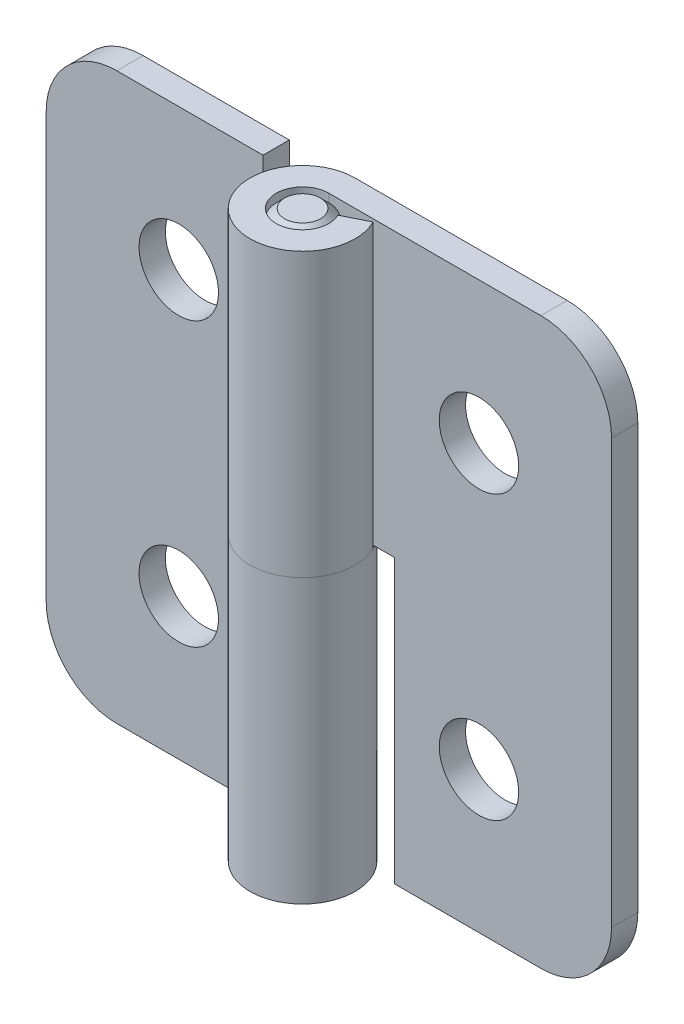
ISO-10303-21;
HEADER;
FILE_DESCRIPTION(('STEP AP214'),'2;1');
FILE_NAME('part.step','',(''),(''),'','','');
FILE_SCHEMA(('AUTOMOTIVE_DESIGN { 1 0 10303 214 1 1 1 1 }'));
ENDSEC;
DATA;
#1=APPLICATION_CONTEXT('core data for automotive mechanical design processes');
#2=APPLICATION_PROTOCOL_DEFINITION('international standard','automotive_design',2000,#1);
#3=PRODUCT_CONTEXT('',#1,'mechanical');
#4=PRODUCT('Part','Part','',(#3));
#5=PRODUCT_RELATED_PRODUCT_CATEGORY('part','',(#4));
#6=PRODUCT_DEFINITION_FORMATION('','',#4);
#7=PRODUCT_DEFINITION_CONTEXT('part definition',#1,'design');
#8=PRODUCT_DEFINITION('design','',#6,#7);
#9=PRODUCT_DEFINITION_SHAPE('','',#8);
#10=(LENGTH_UNIT() NAMED_UNIT(*) SI_UNIT(.MILLI.,.METRE.));
#11=(NAMED_UNIT(*) PLANE_ANGLE_UNIT() SI_UNIT($,.RADIAN.));
#12=(NAMED_UNIT(*) SI_UNIT($,.STERADIAN.) SOLID_ANGLE_UNIT());
#13=UNCERTAINTY_MEASURE_WITH_UNIT(LENGTH_MEASURE(1.E-05),#10,'distance_accuracy_value','');
#14=(GEOMETRIC_REPRESENTATION_CONTEXT(3) GLOBAL_UNCERTAINTY_ASSIGNED_CONTEXT((#13)) GLOBAL_UNIT_ASSIGNED_CONTEXT((#10,
#11,#12)) REPRESENTATION_CONTEXT('',''));
#15=CARTESIAN_POINT('',(0.,0.,0.));
#16=DIRECTION('',(0.,0.,1.));
#17=DIRECTION('',(1.,0.,0.));
#18=AXIS2_PLACEMENT_3D('',#15,#16,#17);
#19=CARTESIAN_POINT('',(1.61289999999782,25.3999999999621,4.7244));
#20=DIRECTION('',(0.,1.,0.));
#21=DIRECTION('',(0.,0.,1.));
#22=AXIS2_PLACEMENT_3D('',#19,#20,#21);
#23=PLANE('',#22);
#24=CARTESIAN_POINT('',(0.,25.3999999999716,4.7244));
#25=DIRECTION('',(0.,-1.,0.));
#26=DIRECTION('',(-1.,0.,0.));
#27=AXIS2_PLACEMENT_3D('',#24,#25,#26);
#28=CIRCLE('',#27,1.61289999994096);
#29=CARTESIAN_POINT('',(-1.61289999994096,25.3999999999716,4.7244));
#30=VERTEX_POINT('',#29);
#31=EDGE_CURVE('P0_E17',#30,#30,#28,.T.);
#32=ORIENTED_EDGE('',*,*,#31,.F.);
#33=EDGE_LOOP('',(#32));
#34=FACE_BOUND('',#33,.T.);
#35=ADVANCED_FACE('P0_F14',(#34),#23,.T.);
#36=CARTESIAN_POINT('',(0.,-25.4,4.7244));
#37=DIRECTION('',(0.,-1.,0.));
#38=DIRECTION('',(0.,0.,-1.));
#39=AXIS2_PLACEMENT_3D('',#36,#37,#38);
#40=PLANE('',#39);
#41=CARTESIAN_POINT('',(0.,-25.4000000000095,4.7244));
#42=DIRECTION('',(0.,1.,0.));
#43=DIRECTION('',(0.,0.,1.));
#44=AXIS2_PLACEMENT_3D('',#41,#42,#43);
#45=CIRCLE('',#44,1.61290000005465);
#46=CARTESIAN_POINT('',(0.,-25.4000000000095,6.33730000005465));
#47=VERTEX_POINT('',#46);
#48=EDGE_CURVE('P0_E26',#47,#47,#45,.T.);
#49=ORIENTED_EDGE('',*,*,#48,.F.);
#50=EDGE_LOOP('',(#49));
#51=FACE_BOUND('',#50,.T.);
#52=ADVANCED_FACE('P0_F37',(#51),#40,.T.);
#53=CARTESIAN_POINT('',(0.,24.6380000000196,4.7244));
#54=DIRECTION('',(0.,-1.,0.));
#55=DIRECTION('',(-1.,0.,0.));
#56=AXIS2_PLACEMENT_3D('',#53,#54,#55);
#57=CONICAL_SURFACE('',#56,2.37489999994978,0.785398163434747);
#58=CARTESIAN_POINT('',(0.,24.6379999999953,4.7244));
#59=DIRECTION('',(0.,-1.,0.));
#60=DIRECTION('',(0.,0.,-1.));
#61=AXIS2_PLACEMENT_3D('',#58,#59,#60);
#62=CIRCLE('',#61,2.37489999996468);
#63=CARTESIAN_POINT('',(0.,24.6379999999953,2.34950000003532));
#64=VERTEX_POINT('',#63);
#65=EDGE_CURVE('P0_E21',#64,#64,#62,.T.);
#66=ORIENTED_EDGE('',*,*,#65,.F.);
#67=EDGE_LOOP('',(#66));
#68=FACE_BOUND('',#67,.T.);
#69=ORIENTED_EDGE('',*,*,#31,.T.);
#70=EDGE_LOOP('',(#69));
#71=FACE_BOUND('',#70,.T.);
#72=ADVANCED_FACE('P0_F34',(#68,#71),#57,.T.);
#73=CARTESIAN_POINT('',(0.,-24.6380000000575,4.7244));
#74=DIRECTION('',(0.,1.,0.));
#75=DIRECTION('',(0.,0.,1.));
#76=AXIS2_PLACEMENT_3D('',#73,#74,#75);
#77=CONICAL_SURFACE('',#76,2.37490000000662,0.785398163397448);
#78=CARTESIAN_POINT('',(0.,-24.6380000000047,4.7244));
#79=DIRECTION('',(0.,-1.,0.));
#80=DIRECTION('',(0.,0.,-1.));
#81=AXIS2_PLACEMENT_3D('',#78,#79,#80);
#82=CIRCLE('',#81,2.37489999996468);
#83=CARTESIAN_POINT('',(0.,-24.6380000000047,2.34950000003532));
#84=VERTEX_POINT('',#83);
#85=EDGE_CURVE('P0_E10',#84,#84,#82,.F.);
#86=ORIENTED_EDGE('',*,*,#85,.F.);
#87=EDGE_LOOP('',(#86));
#88=FACE_BOUND('',#87,.T.);
#89=ORIENTED_EDGE('',*,*,#48,.T.);
#90=EDGE_LOOP('',(#89));
#91=FACE_BOUND('',#90,.T.);
#92=ADVANCED_FACE('P0_F45',(#88,#91),#77,.T.);
#93=CARTESIAN_POINT('',(0.,25.3999999999621,4.7244));
#94=DIRECTION('',(0.,-1.,0.));
#95=DIRECTION('',(0.,0.,-1.));
#96=AXIS2_PLACEMENT_3D('',#93,#94,#95);
#97=CYLINDRICAL_SURFACE('',#96,2.37489999996468);
#98=ORIENTED_EDGE('',*,*,#85,.T.);
#99=EDGE_LOOP('',(#98));
#100=FACE_BOUND('',#99,.T.);
#101=ORIENTED_EDGE('',*,*,#65,.T.);
#102=EDGE_LOOP('',(#101));
#103=FACE_BOUND('',#102,.T.);
#104=ADVANCED_FACE('P0_F43',(#100,#103),#97,.T.);
#105=CLOSED_SHELL('',(#35,#52,#72,#92,#104));
#106=MANIFOLD_SOLID_BREP('P0_B1',#105);
#107=CARTESIAN_POINT('',(-25.4,-25.4,2.3622));
#108=DIRECTION('',(0.,0.,1.));
#109=DIRECTION('',(-1.,0.,0.));
#110=AXIS2_PLACEMENT_3D('',#107,#108,#109);
#111=PLANE('',#110);
#112=DIRECTION('',(1.,0.,0.));
#113=VECTOR('',#112,1.);
#114=CARTESIAN_POINT('',(-25.4,25.4,2.3622));
#115=LINE('',#114,#113);
#116=CARTESIAN_POINT('',(-5.9182,25.4,2.3622));
#117=VERTEX_POINT('',#116);
#118=CARTESIAN_POINT('',(-19.05,25.4,2.3622));
#119=VERTEX_POINT('',#118);
#120=EDGE_CURVE('P1_E116',#117,#119,#115,.F.);
#121=ORIENTED_EDGE('',*,*,#120,.T.);
#122=CARTESIAN_POINT('',(-19.05,19.05,2.3622));
#123=DIRECTION('',(0.,0.,-1.));
#124=DIRECTION('',(1.,0.,0.));
#125=AXIS2_PLACEMENT_3D('',#122,#123,#124);
#126=CIRCLE('',#125,6.35);
#127=CARTESIAN_POINT('',(-25.4,19.05,2.3622));
#128=VERTEX_POINT('',#127);
#129=EDGE_CURVE('P1_E118',#128,#119,#126,.T.);
#130=ORIENTED_EDGE('',*,*,#129,.F.);
#131=DIRECTION('',(0.,-1.,0.));
#132=VECTOR('',#131,1.);
#133=CARTESIAN_POINT('',(-25.4,-25.4,2.3622));
#134=LINE('',#133,#132);
#135=CARTESIAN_POINT('',(-25.4,-19.05,2.3622));
#136=VERTEX_POINT('',#135);
#137=EDGE_CURVE('P1_E121',#136,#128,#134,.F.);
#138=ORIENTED_EDGE('',*,*,#137,.F.);
#139=CARTESIAN_POINT('',(-19.05,-19.05,2.3622));
#140=DIRECTION('',(0.,0.,-1.));
#141=DIRECTION('',(1.,0.,0.));
#142=AXIS2_PLACEMENT_3D('',#139,#140,#141);
#143=CIRCLE('',#142,6.35);
#144=CARTESIAN_POINT('',(-19.05,-25.4,2.3622));
#145=VERTEX_POINT('',#144);
#146=EDGE_CURVE('P1_E148',#145,#136,#143,.T.);
#147=ORIENTED_EDGE('',*,*,#146,.F.);
#148=DIRECTION('',(1.,0.,0.));
#149=VECTOR('',#148,1.);
#150=CARTESIAN_POINT('',(0.,-25.4,2.3622));
#151=LINE('',#150,#149);
#152=CARTESIAN_POINT('',(0.,-25.4,2.3622));
#153=VERTEX_POINT('',#152);
#154=EDGE_CURVE('P1_E101',#145,#153,#151,.T.);
#155=ORIENTED_EDGE('',*,*,#154,.T.);
#156=DIRECTION('',(0.,1.,0.));
#157=VECTOR('',#156,1.);
#158=CARTESIAN_POINT('',(0.,-25.4,2.3622));
#159=LINE('',#158,#157);
#160=CARTESIAN_POINT('',(0.,0.,2.3622));
#161=VERTEX_POINT('',#160);
#162=EDGE_CURVE('P1_E82',#153,#161,#159,.T.);
#163=ORIENTED_EDGE('',*,*,#162,.T.);
#164=DIRECTION('',(1.,0.,0.));
#165=VECTOR('',#164,1.);
#166=CARTESIAN_POINT('',(0.,0.,2.3622));
#167=LINE('',#166,#165);
#168=CARTESIAN_POINT('',(-5.9182,0.,2.3622));
#169=VERTEX_POINT('',#168);
#170=EDGE_CURVE('P1_E145',#169,#161,#167,.T.);
#171=ORIENTED_EDGE('',*,*,#170,.F.);
#172=DIRECTION('',(0.,-1.,0.));
#173=VECTOR('',#172,1.);
#174=CARTESIAN_POINT('',(-5.9182,25.4,2.3622));
#175=LINE('',#174,#173);
#176=EDGE_CURVE('P1_E109',#169,#117,#175,.F.);
#177=ORIENTED_EDGE('',*,*,#176,.T.);
#178=EDGE_LOOP('',(#121,#130,#138,#147,#155,#163,#171,#177));
#179=FACE_BOUND('',#178,.T.);
#180=CARTESIAN_POINT('',(-13.4874,-12.7,2.3622));
#181=DIRECTION('',(0.,0.,-1.));
#182=DIRECTION('',(1.,0.,0.));
#183=AXIS2_PLACEMENT_3D('',#180,#181,#182);
#184=CIRCLE('',#183,3.56869999999999);
#185=CARTESIAN_POINT('',(-9.91870000000002,-12.7,2.3622));
#186=VERTEX_POINT('',#185);
#187=EDGE_CURVE('P1_E87',#186,#186,#184,.T.);
#188=ORIENTED_EDGE('',*,*,#187,.T.);
#189=EDGE_LOOP('',(#188));
#190=FACE_BOUND('',#189,.T.);
#191=CARTESIAN_POINT('',(-13.4874,12.7,2.3622));
#192=DIRECTION('',(0.,0.,-1.));
#193=DIRECTION('',(1.,0.,0.));
#194=AXIS2_PLACEMENT_3D('',#191,#192,#193);
#195=CIRCLE('',#194,3.56869999999999);
#196=CARTESIAN_POINT('',(-9.91870000000002,12.7,2.3622));
#197=VERTEX_POINT('',#196);
#198=EDGE_CURVE('P1_E19',#197,#197,#195,.T.);
#199=ORIENTED_EDGE('',*,*,#198,.T.);
#200=EDGE_LOOP('',(#199));
#201=FACE_BOUND('',#200,.T.);
#202=ADVANCED_FACE('P1_F16',(#179,#190,#201),#111,.T.);
#203=CARTESIAN_POINT('',(0.,-25.4,4.7244));
#204=DIRECTION('',(0.,1.,0.));
#205=DIRECTION('',(0.,0.,1.));
#206=AXIS2_PLACEMENT_3D('',#203,#204,#205);
#207=CYLINDRICAL_SURFACE('',#206,2.3622);
#208=CARTESIAN_POINT('',(0.,-25.4,4.7244));
#209=DIRECTION('',(0.,1.,0.));
#210=DIRECTION('',(0.,0.,1.));
#211=AXIS2_PLACEMENT_3D('',#208,#209,#210);
#212=CIRCLE('',#211,2.3622);
#213=CARTESIAN_POINT('',(-2.11396831338599,-25.4,3.6703));
#214=VERTEX_POINT('',#213);
#215=EDGE_CURVE('P1_E76',#153,#214,#212,.F.);
#216=ORIENTED_EDGE('',*,*,#215,.T.);
#217=DIRECTION('',(0.,-1.,0.));
#218=VECTOR('',#217,1.);
#219=CARTESIAN_POINT('',(-2.11396831338599,-25.4,3.6703));
#220=LINE('',#219,#218);
#221=CARTESIAN_POINT('',(-2.11396831338599,0.,3.6703));
#222=VERTEX_POINT('',#221);
#223=EDGE_CURVE('P1_E79',#222,#214,#220,.T.);
#224=ORIENTED_EDGE('',*,*,#223,.F.);
#225=CARTESIAN_POINT('',(0.,0.,4.7244));
#226=DIRECTION('',(0.,1.,0.));
#227=DIRECTION('',(0.,0.,1.));
#228=AXIS2_PLACEMENT_3D('',#225,#226,#227);
#229=CIRCLE('',#228,2.3622);
#230=EDGE_CURVE('P1_E142',#161,#222,#229,.F.);
#231=ORIENTED_EDGE('',*,*,#230,.F.);
#232=ORIENTED_EDGE('',*,*,#162,.F.);
#233=EDGE_LOOP('',(#216,#224,#231,#232));
#234=FACE_BOUND('',#233,.T.);
#235=ADVANCED_FACE('P1_F78',(#234),#207,.F.);
#236=CARTESIAN_POINT('',(-2.11396831338599,-25.4,3.6703));
#237=DIRECTION('',(0.446236559139785,0.,-0.89491504249682));
#238=DIRECTION('',(0.89491504249682,0.,0.446236559139785));
#239=AXIS2_PLACEMENT_3D('',#236,#237,#238);
#240=PLANE('',#239);
#241=DIRECTION('',(-0.89491504249682,0.,-0.446236559139785));
#242=VECTOR('',#241,1.);
#243=CARTESIAN_POINT('',(-2.11396831338599,-25.4,3.6703));
#244=LINE('',#243,#242);
#245=CARTESIAN_POINT('',(-4.22793662677198,-25.4,2.6162));
#246=VERTEX_POINT('',#245);
#247=EDGE_CURVE('P1_E86',#214,#246,#244,.T.);
#248=ORIENTED_EDGE('',*,*,#247,.T.);
#249=DIRECTION('',(0.,1.,0.));
#250=VECTOR('',#249,1.);
#251=CARTESIAN_POINT('',(-4.22793662677198,-25.4,2.6162));
#252=LINE('',#251,#250);
#253=CARTESIAN_POINT('',(-4.22793662677198,0.,2.6162));
#254=VERTEX_POINT('',#253);
#255=EDGE_CURVE('P1_E95',#254,#246,#252,.F.);
#256=ORIENTED_EDGE('',*,*,#255,.F.);
#257=DIRECTION('',(-0.89491504249682,0.,-0.446236559139785));
#258=VECTOR('',#257,1.);
#259=CARTESIAN_POINT('',(-2.11396831338599,0.,3.6703));
#260=LINE('',#259,#258);
#261=EDGE_CURVE('P1_E94',#222,#254,#260,.T.);
#262=ORIENTED_EDGE('',*,*,#261,.F.);
#263=ORIENTED_EDGE('',*,*,#223,.T.);
#264=EDGE_LOOP('',(#248,#256,#262,#263));
#265=FACE_BOUND('',#264,.T.);
#266=ADVANCED_FACE('P1_F91',(#265),#240,.T.);
#267=CARTESIAN_POINT('',(-13.4874,12.7,0.));
#268=DIRECTION('',(0.,0.,-1.));
#269=DIRECTION('',(1.,0.,0.));
#270=AXIS2_PLACEMENT_3D('',#267,#268,#269);
#271=CYLINDRICAL_SURFACE('',#270,3.56869999999999);
#272=CARTESIAN_POINT('',(-13.4874,12.7,0.));
#273=DIRECTION('',(0.,0.,-1.));
#274=DIRECTION('',(1.,0.,0.));
#275=AXIS2_PLACEMENT_3D('',#272,#273,#274);
#276=CIRCLE('',#275,3.56869999999999);
#277=CARTESIAN_POINT('',(-9.91870000000002,12.7,0.));
#278=VERTEX_POINT('',#277);
#279=EDGE_CURVE('P1_E137',#278,#278,#276,.F.);
#280=ORIENTED_EDGE('',*,*,#279,.F.);
#281=EDGE_LOOP('',(#280));
#282=FACE_BOUND('',#281,.T.);
#283=ORIENTED_EDGE('',*,*,#198,.F.);
#284=EDGE_LOOP('',(#283));
#285=FACE_BOUND('',#284,.T.);
#286=ADVANCED_FACE('P1_F156',(#282,#285),#271,.F.);
#287=CARTESIAN_POINT('',(-13.4874,-12.7,0.));
#288=DIRECTION('',(0.,0.,-1.));
#289=DIRECTION('',(1.,0.,0.));
#290=AXIS2_PLACEMENT_3D('',#287,#288,#289);
#291=CYLINDRICAL_SURFACE('',#290,3.56869999999999);
#292=CARTESIAN_POINT('',(-13.4874,-12.7,0.));
#293=DIRECTION('',(0.,0.,-1.));
#294=DIRECTION('',(1.,0.,0.));
#295=AXIS2_PLACEMENT_3D('',#292,#293,#294);
#296=CIRCLE('',#295,3.56869999999999);
#297=CARTESIAN_POINT('',(-9.91870000000002,-12.7,0.));
#298=VERTEX_POINT('',#297);
#299=EDGE_CURVE('P1_E134',#298,#298,#296,.F.);
#300=ORIENTED_EDGE('',*,*,#299,.F.);
#301=EDGE_LOOP('',(#300));
#302=FACE_BOUND('',#301,.T.);
#303=ORIENTED_EDGE('',*,*,#187,.F.);
#304=EDGE_LOOP('',(#303));
#305=FACE_BOUND('',#304,.T.);
#306=ADVANCED_FACE('P1_F158',(#302,#305),#291,.F.);
#307=CARTESIAN_POINT('',(0.,-25.4,4.7244));
#308=DIRECTION('',(0.,1.,0.));
#309=DIRECTION('',(0.,0.,1.));
#310=AXIS2_PLACEMENT_3D('',#307,#308,#309);
#311=PLANE('',#310);
#312=DIRECTION('',(0.,0.,-1.));
#313=VECTOR('',#312,1.);
#314=CARTESIAN_POINT('',(-19.05,-25.4,0.));
#315=LINE('',#314,#313);
#316=CARTESIAN_POINT('',(-19.05,-25.4,0.));
#317=VERTEX_POINT('',#316);
#318=EDGE_CURVE('P1_E103',#317,#145,#315,.F.);
#319=ORIENTED_EDGE('',*,*,#318,.F.);
#320=DIRECTION('',(1.,0.,0.));
#321=VECTOR('',#320,1.);
#322=CARTESIAN_POINT('',(0.,-25.4,0.));
#323=LINE('',#322,#321);
#324=CARTESIAN_POINT('',(0.,-25.4,0.));
#325=VERTEX_POINT('',#324);
#326=EDGE_CURVE('P1_E133',#325,#317,#323,.F.);
#327=ORIENTED_EDGE('',*,*,#326,.F.);
#328=CARTESIAN_POINT('',(0.,-25.4,4.7244));
#329=DIRECTION('',(0.,1.,0.));
#330=DIRECTION('',(0.,0.,1.));
#331=AXIS2_PLACEMENT_3D('',#328,#329,#330);
#332=CIRCLE('',#331,4.7244);
#333=EDGE_CURVE('P1_E100',#246,#325,#332,.T.);
#334=ORIENTED_EDGE('',*,*,#333,.F.);
#335=ORIENTED_EDGE('',*,*,#247,.F.);
#336=ORIENTED_EDGE('',*,*,#215,.F.);
#337=ORIENTED_EDGE('',*,*,#154,.F.);
#338=EDGE_LOOP('',(#319,#327,#334,#335,#336,#337));
#339=FACE_BOUND('',#338,.T.);
#340=ADVANCED_FACE('P1_F98',(#339),#311,.F.);
#341=CARTESIAN_POINT('',(-19.05,-19.05,0.));
#342=DIRECTION('',(0.,0.,-1.));
#343=DIRECTION('',(1.,0.,0.));
#344=AXIS2_PLACEMENT_3D('',#341,#342,#343);
#345=CYLINDRICAL_SURFACE('',#344,6.35);
#346=ORIENTED_EDGE('',*,*,#146,.T.);
#347=DIRECTION('',(0.,0.,-1.));
#348=VECTOR('',#347,1.);
#349=CARTESIAN_POINT('',(-25.4,-19.05,0.));
#350=LINE('',#349,#348);
#351=CARTESIAN_POINT('',(-25.4,-19.05,0.));
#352=VERTEX_POINT('',#351);
#353=EDGE_CURVE('P1_E124',#352,#136,#350,.F.);
#354=ORIENTED_EDGE('',*,*,#353,.F.);
#355=CARTESIAN_POINT('',(-19.05,-19.05,0.));
#356=DIRECTION('',(0.,0.,-1.));
#357=DIRECTION('',(1.,0.,0.));
#358=AXIS2_PLACEMENT_3D('',#355,#356,#357);
#359=CIRCLE('',#358,6.35);
#360=EDGE_CURVE('P1_E130',#317,#352,#359,.T.);
#361=ORIENTED_EDGE('',*,*,#360,.F.);
#362=ORIENTED_EDGE('',*,*,#318,.T.);
#363=EDGE_LOOP('',(#346,#354,#361,#362));
#364=FACE_BOUND('',#363,.T.);
#365=ADVANCED_FACE('P1_F201',(#364),#345,.T.);
#366=CARTESIAN_POINT('',(-25.4,-25.4,0.));
#367=DIRECTION('',(-1.,0.,0.));
#368=DIRECTION('',(0.,0.,-1.));
#369=AXIS2_PLACEMENT_3D('',#366,#367,#368);
#370=PLANE('',#369);
#371=ORIENTED_EDGE('',*,*,#137,.T.);
#372=DIRECTION('',(0.,0.,-1.));
#373=VECTOR('',#372,1.);
#374=CARTESIAN_POINT('',(-25.4,19.05,0.));
#375=LINE('',#374,#373);
#376=CARTESIAN_POINT('',(-25.4,19.05,0.));
#377=VERTEX_POINT('',#376);
#378=EDGE_CURVE('P1_E123',#377,#128,#375,.F.);
#379=ORIENTED_EDGE('',*,*,#378,.F.);
#380=DIRECTION('',(0.,-1.,0.));
#381=VECTOR('',#380,1.);
#382=CARTESIAN_POINT('',(-25.4,-25.4,0.));
#383=LINE('',#382,#381);
#384=EDGE_CURVE('P1_E129',#352,#377,#383,.F.);
#385=ORIENTED_EDGE('',*,*,#384,.F.);
#386=ORIENTED_EDGE('',*,*,#353,.T.);
#387=EDGE_LOOP('',(#371,#379,#385,#386));
#388=FACE_BOUND('',#387,.T.);
#389=ADVANCED_FACE('P1_F197',(#388),#370,.T.);
#390=CARTESIAN_POINT('',(-19.05,19.05,0.));
#391=DIRECTION('',(0.,0.,-1.));
#392=DIRECTION('',(1.,0.,0.));
#393=AXIS2_PLACEMENT_3D('',#390,#391,#392);
#394=CYLINDRICAL_SURFACE('',#393,6.35);
#395=ORIENTED_EDGE('',*,*,#129,.T.);
#396=DIRECTION('',(0.,0.,-1.));
#397=VECTOR('',#396,1.);
#398=CARTESIAN_POINT('',(-19.05,25.4,0.));
#399=LINE('',#398,#397);
#400=CARTESIAN_POINT('',(-19.05,25.4,0.));
#401=VERTEX_POINT('',#400);
#402=EDGE_CURVE('P1_E113',#119,#401,#399,.T.);
#403=ORIENTED_EDGE('',*,*,#402,.T.);
#404=CARTESIAN_POINT('',(-19.05,19.05,0.));
#405=DIRECTION('',(0.,0.,-1.));
#406=DIRECTION('',(1.,0.,0.));
#407=AXIS2_PLACEMENT_3D('',#404,#405,#406);
#408=CIRCLE('',#407,6.35);
#409=EDGE_CURVE('P1_E125',#377,#401,#408,.T.);
#410=ORIENTED_EDGE('',*,*,#409,.F.);
#411=ORIENTED_EDGE('',*,*,#378,.T.);
#412=EDGE_LOOP('',(#395,#403,#410,#411));
#413=FACE_BOUND('',#412,.T.);
#414=ADVANCED_FACE('P1_F193',(#413),#394,.T.);
#415=CARTESIAN_POINT('',(-25.4,25.4,0.));
#416=DIRECTION('',(0.,-1.,0.));
#417=DIRECTION('',(0.,0.,-1.));
#418=AXIS2_PLACEMENT_3D('',#415,#416,#417);
#419=PLANE('',#418);
#420=ORIENTED_EDGE('',*,*,#402,.F.);
#421=ORIENTED_EDGE('',*,*,#120,.F.);
#422=DIRECTION('',(0.,0.,-1.));
#423=VECTOR('',#422,1.);
#424=CARTESIAN_POINT('',(-5.9182,25.4,0.));
#425=LINE('',#424,#423);
#426=CARTESIAN_POINT('',(-5.9182,25.4,0.));
#427=VERTEX_POINT('',#426);
#428=EDGE_CURVE('P1_E112',#117,#427,#425,.T.);
#429=ORIENTED_EDGE('',*,*,#428,.T.);
#430=DIRECTION('',(1.,0.,0.));
#431=VECTOR('',#430,1.);
#432=CARTESIAN_POINT('',(0.,25.4,0.));
#433=LINE('',#432,#431);
#434=EDGE_CURVE('P1_E128',#401,#427,#433,.T.);
#435=ORIENTED_EDGE('',*,*,#434,.F.);
#436=EDGE_LOOP('',(#420,#421,#429,#435));
#437=FACE_BOUND('',#436,.T.);
#438=ADVANCED_FACE('P1_F189',(#437),#419,.F.);
#439=CARTESIAN_POINT('',(-5.9182,25.4,0.));
#440=DIRECTION('',(-1.,0.,0.));
#441=DIRECTION('',(0.,0.,-1.));
#442=AXIS2_PLACEMENT_3D('',#439,#440,#441);
#443=PLANE('',#442);
#444=DIRECTION('',(0.,-1.,0.));
#445=VECTOR('',#444,1.);
#446=CARTESIAN_POINT('',(-5.9182,-25.4,0.));
#447=LINE('',#446,#445);
#448=CARTESIAN_POINT('',(-5.9182,0.,0.));
#449=VERTEX_POINT('',#448);
#450=EDGE_CURVE('P1_E431',#427,#449,#447,.T.);
#451=ORIENTED_EDGE('',*,*,#450,.F.);
#452=ORIENTED_EDGE('',*,*,#428,.F.);
#453=ORIENTED_EDGE('',*,*,#176,.F.);
#454=DIRECTION('',(0.,0.,1.));
#455=VECTOR('',#454,1.);
#456=CARTESIAN_POINT('',(-5.9182,0.,4.7244));
#457=LINE('',#456,#455);
#458=EDGE_CURVE('P1_E429',#449,#169,#457,.T.);
#459=ORIENTED_EDGE('',*,*,#458,.F.);
#460=EDGE_LOOP('',(#451,#452,#453,#459));
#461=FACE_BOUND('',#460,.T.);
#462=ADVANCED_FACE('P1_F186',(#461),#443,.F.);
#463=CARTESIAN_POINT('',(0.,0.,4.7244));
#464=DIRECTION('',(0.,1.,0.));
#465=DIRECTION('',(0.,0.,1.));
#466=AXIS2_PLACEMENT_3D('',#463,#464,#465);
#467=PLANE('',#466);
#468=CARTESIAN_POINT('',(0.,0.,4.7244));
#469=DIRECTION('',(0.,1.,0.));
#470=DIRECTION('',(0.,0.,1.));
#471=AXIS2_PLACEMENT_3D('',#468,#469,#470);
#472=CIRCLE('',#471,4.7244);
#473=CARTESIAN_POINT('',(0.,0.,0.));
#474=VERTEX_POINT('',#473);
#475=EDGE_CURVE('P1_E34',#474,#254,#472,.F.);
#476=ORIENTED_EDGE('',*,*,#475,.F.);
#477=DIRECTION('',(1.,0.,0.));
#478=VECTOR('',#477,1.);
#479=CARTESIAN_POINT('',(0.,0.,0.));
#480=LINE('',#479,#478);
#481=EDGE_CURVE('P1_E25',#449,#474,#480,.T.);
#482=ORIENTED_EDGE('',*,*,#481,.F.);
#483=ORIENTED_EDGE('',*,*,#458,.T.);
#484=ORIENTED_EDGE('',*,*,#170,.T.);
#485=ORIENTED_EDGE('',*,*,#230,.T.);
#486=ORIENTED_EDGE('',*,*,#261,.T.);
#487=EDGE_LOOP('',(#476,#482,#483,#484,#485,#486));
#488=FACE_BOUND('',#487,.T.);
#489=ADVANCED_FACE('P1_F178',(#488),#467,.T.);
#490=CARTESIAN_POINT('',(0.,-25.4,4.7244));
#491=DIRECTION('',(0.,1.,0.));
#492=DIRECTION('',(0.,0.,1.));
#493=AXIS2_PLACEMENT_3D('',#490,#491,#492);
#494=CYLINDRICAL_SURFACE('',#493,4.7244);
#495=DIRECTION('',(0.,-1.,0.));
#496=VECTOR('',#495,1.);
#497=CARTESIAN_POINT('',(0.,-25.4,0.));
#498=LINE('',#497,#496);
#499=EDGE_CURVE('P1_E11',#474,#325,#498,.T.);
#500=ORIENTED_EDGE('',*,*,#499,.F.);
#501=ORIENTED_EDGE('',*,*,#475,.T.);
#502=ORIENTED_EDGE('',*,*,#255,.T.);
#503=ORIENTED_EDGE('',*,*,#333,.T.);
#504=EDGE_LOOP('',(#500,#501,#502,#503));
#505=FACE_BOUND('',#504,.T.);
#506=ADVANCED_FACE('P1_F172',(#505),#494,.T.);
#507=CARTESIAN_POINT('',(0.,-25.4,0.));
#508=DIRECTION('',(0.,0.,-1.));
#509=DIRECTION('',(1.,0.,0.));
#510=AXIS2_PLACEMENT_3D('',#507,#508,#509);
#511=PLANE('',#510);
#512=ORIENTED_EDGE('',*,*,#481,.T.);
#513=ORIENTED_EDGE('',*,*,#499,.T.);
#514=ORIENTED_EDGE('',*,*,#326,.T.);
#515=ORIENTED_EDGE('',*,*,#360,.T.);
#516=ORIENTED_EDGE('',*,*,#384,.T.);
#517=ORIENTED_EDGE('',*,*,#409,.T.);
#518=ORIENTED_EDGE('',*,*,#434,.T.);
#519=ORIENTED_EDGE('',*,*,#450,.T.);
#520=EDGE_LOOP('',(#512,#513,#514,#515,#516,#517,#518,#519));
#521=FACE_BOUND('',#520,.T.);
#522=ORIENTED_EDGE('',*,*,#299,.T.);
#523=EDGE_LOOP('',(#522));
#524=FACE_BOUND('',#523,.T.);
#525=ORIENTED_EDGE('',*,*,#279,.T.);
#526=EDGE_LOOP('',(#525));
#527=FACE_BOUND('',#526,.T.);
#528=ADVANCED_FACE('P1_F170',(#521,#524,#527),#511,.T.);
#529=CLOSED_SHELL('',(#202,#235,#266,#286,#306,#340,#365,#389,#414,#438,#462,#489,#506,#528));
#530=MANIFOLD_SOLID_BREP('P1_B1',#529);
#531=CARTESIAN_POINT('',(25.4,25.4,2.3622));
#532=DIRECTION('',(0.,0.,1.));
#533=DIRECTION('',(1.,0.,0.));
#534=AXIS2_PLACEMENT_3D('',#531,#532,#533);
#535=PLANE('',#534);
#536=DIRECTION('',(-1.,0.,0.));
#537=VECTOR('',#536,1.);
#538=CARTESIAN_POINT('',(25.4,-25.4,2.3622));
#539=LINE('',#538,#537);
#540=CARTESIAN_POINT('',(5.9182,-25.4,2.3622));
#541=VERTEX_POINT('',#540);
#542=CARTESIAN_POINT('',(19.05,-25.4,2.3622));
#543=VERTEX_POINT('',#542);
#544=EDGE_CURVE('P2_E116',#541,#543,#539,.F.);
#545=ORIENTED_EDGE('',*,*,#544,.T.);
#546=CARTESIAN_POINT('',(19.05,-19.05,2.3622));
#547=DIRECTION('',(0.,0.,-1.));
#548=DIRECTION('',(-1.,0.,0.));
#549=AXIS2_PLACEMENT_3D('',#546,#547,#548);
#550=CIRCLE('',#549,6.35);
#551=CARTESIAN_POINT('',(25.4,-19.05,2.3622));
#552=VERTEX_POINT('',#551);
#553=EDGE_CURVE('P2_E118',#552,#543,#550,.T.);
#554=ORIENTED_EDGE('',*,*,#553,.F.);
#555=DIRECTION('',(0.,1.,0.));
#556=VECTOR('',#555,1.);
#557=CARTESIAN_POINT('',(25.4,25.4,2.3622));
#558=LINE('',#557,#556);
#559=CARTESIAN_POINT('',(25.4,19.05,2.3622));
#560=VERTEX_POINT('',#559);
#561=EDGE_CURVE('P2_E121',#560,#552,#558,.F.);
#562=ORIENTED_EDGE('',*,*,#561,.F.);
#563=CARTESIAN_POINT('',(19.05,19.05,2.3622));
#564=DIRECTION('',(0.,0.,-1.));
#565=DIRECTION('',(-1.,0.,0.));
#566=AXIS2_PLACEMENT_3D('',#563,#564,#565);
#567=CIRCLE('',#566,6.35);
#568=CARTESIAN_POINT('',(19.05,25.4,2.3622));
#569=VERTEX_POINT('',#568);
#570=EDGE_CURVE('P2_E148',#569,#560,#567,.T.);
#571=ORIENTED_EDGE('',*,*,#570,.F.);
#572=DIRECTION('',(-1.,0.,0.));
#573=VECTOR('',#572,1.);
#574=CARTESIAN_POINT('',(0.,25.4,2.3622));
#575=LINE('',#574,#573);
#576=CARTESIAN_POINT('',(0.,25.4,2.36219999999999));
#577=VERTEX_POINT('',#576);
#578=EDGE_CURVE('P2_E101',#569,#577,#575,.T.);
#579=ORIENTED_EDGE('',*,*,#578,.T.);
#580=DIRECTION('',(0.,-1.,0.));
#581=VECTOR('',#580,1.);
#582=CARTESIAN_POINT('',(0.,25.4,2.36219999999999));
#583=LINE('',#582,#581);
#584=CARTESIAN_POINT('',(0.,0.,2.3622));
#585=VERTEX_POINT('',#584);
#586=EDGE_CURVE('P2_E82',#577,#585,#583,.T.);
#587=ORIENTED_EDGE('',*,*,#586,.T.);
#588=DIRECTION('',(-1.,0.,0.));
#589=VECTOR('',#588,1.);
#590=CARTESIAN_POINT('',(0.,0.,2.3622));
#591=LINE('',#590,#589);
#592=CARTESIAN_POINT('',(5.9182,0.,2.3622));
#593=VERTEX_POINT('',#592);
#594=EDGE_CURVE('P2_E145',#593,#585,#591,.T.);
#595=ORIENTED_EDGE('',*,*,#594,.F.);
#596=DIRECTION('',(0.,1.,0.));
#597=VECTOR('',#596,1.);
#598=CARTESIAN_POINT('',(5.9182,-25.4,2.3622));
#599=LINE('',#598,#597);
#600=EDGE_CURVE('P2_E109',#593,#541,#599,.F.);
#601=ORIENTED_EDGE('',*,*,#600,.T.);
#602=EDGE_LOOP('',(#545,#554,#562,#571,#579,#587,#595,#601));
#603=FACE_BOUND('',#602,.T.);
#604=CARTESIAN_POINT('',(13.4874,12.7,2.3622));
#605=DIRECTION('',(0.,0.,-1.));
#606=DIRECTION('',(-1.,0.,0.));
#607=AXIS2_PLACEMENT_3D('',#604,#605,#606);
#608=CIRCLE('',#607,3.56869999999999);
#609=CARTESIAN_POINT('',(9.91870000000002,12.7,2.3622));
#610=VERTEX_POINT('',#609);
#611=EDGE_CURVE('P2_E87',#610,#610,#608,.T.);
#612=ORIENTED_EDGE('',*,*,#611,.T.);
#613=EDGE_LOOP('',(#612));
#614=FACE_BOUND('',#613,.T.);
#615=CARTESIAN_POINT('',(13.4874,-12.7,2.3622));
#616=DIRECTION('',(0.,0.,-1.));
#617=DIRECTION('',(-1.,0.,0.));
#618=AXIS2_PLACEMENT_3D('',#615,#616,#617);
#619=CIRCLE('',#618,3.56869999999999);
#620=CARTESIAN_POINT('',(9.91870000000002,-12.7,2.3622));
#621=VERTEX_POINT('',#620);
#622=EDGE_CURVE('P2_E19',#621,#621,#619,.T.);
#623=ORIENTED_EDGE('',*,*,#622,.T.);
#624=EDGE_LOOP('',(#623));
#625=FACE_BOUND('',#624,.T.);
#626=ADVANCED_FACE('P2_F16',(#603,#614,#625),#535,.T.);
#627=CARTESIAN_POINT('',(0.,25.4,4.7244));
#628=DIRECTION('',(0.,-1.,0.));
#629=DIRECTION('',(0.,0.,1.));
#630=AXIS2_PLACEMENT_3D('',#627,#628,#629);
#631=CYLINDRICAL_SURFACE('',#630,2.3622);
#632=CARTESIAN_POINT('',(0.,25.4,4.7244));
#633=DIRECTION('',(0.,-1.,0.));
#634=DIRECTION('',(0.,0.,1.));
#635=AXIS2_PLACEMENT_3D('',#632,#633,#634);
#636=CIRCLE('',#635,2.3622);
#637=CARTESIAN_POINT('',(2.11396831338599,25.4,3.6703));
#638=VERTEX_POINT('',#637);
#639=EDGE_CURVE('P2_E76',#577,#638,#636,.F.);
#640=ORIENTED_EDGE('',*,*,#639,.T.);
#641=DIRECTION('',(0.,1.,0.));
#642=VECTOR('',#641,1.);
#643=CARTESIAN_POINT('',(2.11396831338599,25.4,3.6703));
#644=LINE('',#643,#642);
#645=CARTESIAN_POINT('',(2.11396831338599,0.,3.6703));
#646=VERTEX_POINT('',#645);
#647=EDGE_CURVE('P2_E79',#646,#638,#644,.T.);
#648=ORIENTED_EDGE('',*,*,#647,.F.);
#649=CARTESIAN_POINT('',(0.,0.,4.7244));
#650=DIRECTION('',(0.,-1.,0.));
#651=DIRECTION('',(0.,0.,1.));
#652=AXIS2_PLACEMENT_3D('',#649,#650,#651);
#653=CIRCLE('',#652,2.3622);
#654=EDGE_CURVE('P2_E142',#585,#646,#653,.F.);
#655=ORIENTED_EDGE('',*,*,#654,.F.);
#656=ORIENTED_EDGE('',*,*,#586,.F.);
#657=EDGE_LOOP('',(#640,#648,#655,#656));
#658=FACE_BOUND('',#657,.T.);
#659=ADVANCED_FACE('P2_F78',(#658),#631,.F.);
#660=CARTESIAN_POINT('',(2.11396831338599,25.4,3.6703));
#661=DIRECTION('',(-0.446236559139785,0.,-0.89491504249682));
#662=DIRECTION('',(-0.89491504249682,0.,0.446236559139785));
#663=AXIS2_PLACEMENT_3D('',#660,#661,#662);
#664=PLANE('',#663);
#665=DIRECTION('',(0.89491504249682,0.,-0.446236559139785));
#666=VECTOR('',#665,1.);
#667=CARTESIAN_POINT('',(2.11396831338599,25.4,3.6703));
#668=LINE('',#667,#666);
#669=CARTESIAN_POINT('',(4.22793662677198,25.4,2.6162));
#670=VERTEX_POINT('',#669);
#671=EDGE_CURVE('P2_E86',#638,#670,#668,.T.);
#672=ORIENTED_EDGE('',*,*,#671,.T.);
#673=DIRECTION('',(0.,-1.,0.));
#674=VECTOR('',#673,1.);
#675=CARTESIAN_POINT('',(4.22793662677198,25.4,2.6162));
#676=LINE('',#675,#674);
#677=CARTESIAN_POINT('',(4.22793662677198,0.,2.6162));
#678=VERTEX_POINT('',#677);
#679=EDGE_CURVE('P2_E95',#678,#670,#676,.F.);
#680=ORIENTED_EDGE('',*,*,#679,.F.);
#681=DIRECTION('',(0.89491504249682,0.,-0.446236559139785));
#682=VECTOR('',#681,1.);
#683=CARTESIAN_POINT('',(2.11396831338599,0.,3.6703));
#684=LINE('',#683,#682);
#685=EDGE_CURVE('P2_E94',#646,#678,#684,.T.);
#686=ORIENTED_EDGE('',*,*,#685,.F.);
#687=ORIENTED_EDGE('',*,*,#647,.T.);
#688=EDGE_LOOP('',(#672,#680,#686,#687));
#689=FACE_BOUND('',#688,.T.);
#690=ADVANCED_FACE('P2_F91',(#689),#664,.T.);
#691=CARTESIAN_POINT('',(13.4874,-12.7,0.));
#692=DIRECTION('',(0.,0.,-1.));
#693=DIRECTION('',(-1.,0.,0.));
#694=AXIS2_PLACEMENT_3D('',#691,#692,#693);
#695=CYLINDRICAL_SURFACE('',#694,3.56869999999999);
#696=CARTESIAN_POINT('',(13.4874,-12.7,0.));
#697=DIRECTION('',(0.,0.,-1.));
#698=DIRECTION('',(-1.,0.,0.));
#699=AXIS2_PLACEMENT_3D('',#696,#697,#698);
#700=CIRCLE('',#699,3.56869999999999);
#701=CARTESIAN_POINT('',(9.91870000000002,-12.7,0.));
#702=VERTEX_POINT('',#701);
#703=EDGE_CURVE('P2_E137',#702,#702,#700,.F.);
#704=ORIENTED_EDGE('',*,*,#703,.F.);
#705=EDGE_LOOP('',(#704));
#706=FACE_BOUND('',#705,.T.);
#707=ORIENTED_EDGE('',*,*,#622,.F.);
#708=EDGE_LOOP('',(#707));
#709=FACE_BOUND('',#708,.T.);
#710=ADVANCED_FACE('P2_F156',(#706,#709),#695,.F.);
#711=CARTESIAN_POINT('',(13.4874,12.7,0.));
#712=DIRECTION('',(0.,0.,-1.));
#713=DIRECTION('',(-1.,0.,0.));
#714=AXIS2_PLACEMENT_3D('',#711,#712,#713);
#715=CYLINDRICAL_SURFACE('',#714,3.56869999999999);
#716=CARTESIAN_POINT('',(13.4874,12.7,0.));
#717=DIRECTION('',(0.,0.,-1.));
#718=DIRECTION('',(-1.,0.,0.));
#719=AXIS2_PLACEMENT_3D('',#716,#717,#718);
#720=CIRCLE('',#719,3.56869999999999);
#721=CARTESIAN_POINT('',(9.91870000000002,12.7,0.));
#722=VERTEX_POINT('',#721);
#723=EDGE_CURVE('P2_E134',#722,#722,#720,.F.);
#724=ORIENTED_EDGE('',*,*,#723,.F.);
#725=EDGE_LOOP('',(#724));
#726=FACE_BOUND('',#725,.T.);
#727=ORIENTED_EDGE('',*,*,#611,.F.);
#728=EDGE_LOOP('',(#727));
#729=FACE_BOUND('',#728,.T.);
#730=ADVANCED_FACE('P2_F158',(#726,#729),#715,.F.);
#731=CARTESIAN_POINT('',(0.,25.4,4.7244));
#732=DIRECTION('',(0.,-1.,0.));
#733=DIRECTION('',(0.,0.,1.));
#734=AXIS2_PLACEMENT_3D('',#731,#732,#733);
#735=PLANE('',#734);
#736=DIRECTION('',(0.,0.,-1.));
#737=VECTOR('',#736,1.);
#738=CARTESIAN_POINT('',(19.05,25.4,0.));
#739=LINE('',#738,#737);
#740=CARTESIAN_POINT('',(19.05,25.4,0.));
#741=VERTEX_POINT('',#740);
#742=EDGE_CURVE('P2_E103',#741,#569,#739,.F.);
#743=ORIENTED_EDGE('',*,*,#742,.F.);
#744=DIRECTION('',(-1.,0.,0.));
#745=VECTOR('',#744,1.);
#746=CARTESIAN_POINT('',(0.,25.4,0.));
#747=LINE('',#746,#745);
#748=CARTESIAN_POINT('',(0.,25.4,0.));
#749=VERTEX_POINT('',#748);
#750=EDGE_CURVE('P2_E133',#749,#741,#747,.F.);
#751=ORIENTED_EDGE('',*,*,#750,.F.);
#752=CARTESIAN_POINT('',(0.,25.4,4.7244));
#753=DIRECTION('',(0.,-1.,0.));
#754=DIRECTION('',(0.,0.,1.));
#755=AXIS2_PLACEMENT_3D('',#752,#753,#754);
#756=CIRCLE('',#755,4.7244);
#757=EDGE_CURVE('P2_E100',#670,#749,#756,.T.);
#758=ORIENTED_EDGE('',*,*,#757,.F.);
#759=ORIENTED_EDGE('',*,*,#671,.F.);
#760=ORIENTED_EDGE('',*,*,#639,.F.);
#761=ORIENTED_EDGE('',*,*,#578,.F.);
#762=EDGE_LOOP('',(#743,#751,#758,#759,#760,#761));
#763=FACE_BOUND('',#762,.T.);
#764=ADVANCED_FACE('P2_F98',(#763),#735,.F.);
#765=CARTESIAN_POINT('',(19.05,19.05,0.));
#766=DIRECTION('',(0.,0.,-1.));
#767=DIRECTION('',(-1.,0.,0.));
#768=AXIS2_PLACEMENT_3D('',#765,#766,#767);
#769=CYLINDRICAL_SURFACE('',#768,6.35);
#770=ORIENTED_EDGE('',*,*,#570,.T.);
#771=DIRECTION('',(0.,0.,-1.));
#772=VECTOR('',#771,1.);
#773=CARTESIAN_POINT('',(25.4,19.05,0.));
#774=LINE('',#773,#772);
#775=CARTESIAN_POINT('',(25.4,19.05,0.));
#776=VERTEX_POINT('',#775);
#777=EDGE_CURVE('P2_E124',#776,#560,#774,.F.);
#778=ORIENTED_EDGE('',*,*,#777,.F.);
#779=CARTESIAN_POINT('',(19.05,19.05,0.));
#780=DIRECTION('',(0.,0.,-1.));
#781=DIRECTION('',(-1.,0.,0.));
#782=AXIS2_PLACEMENT_3D('',#779,#780,#781);
#783=CIRCLE('',#782,6.35);
#784=EDGE_CURVE('P2_E130',#741,#776,#783,.T.);
#785=ORIENTED_EDGE('',*,*,#784,.F.);
#786=ORIENTED_EDGE('',*,*,#742,.T.);
#787=EDGE_LOOP('',(#770,#778,#785,#786));
#788=FACE_BOUND('',#787,.T.);
#789=ADVANCED_FACE('P2_F201',(#788),#769,.T.);
#790=CARTESIAN_POINT('',(25.4,25.4,0.));
#791=DIRECTION('',(1.,0.,0.));
#792=DIRECTION('',(0.,0.,-1.));
#793=AXIS2_PLACEMENT_3D('',#790,#791,#792);
#794=PLANE('',#793);
#795=ORIENTED_EDGE('',*,*,#561,.T.);
#796=DIRECTION('',(0.,0.,-1.));
#797=VECTOR('',#796,1.);
#798=CARTESIAN_POINT('',(25.4,-19.05,0.));
#799=LINE('',#798,#797);
#800=CARTESIAN_POINT('',(25.4,-19.05,0.));
#801=VERTEX_POINT('',#800);
#802=EDGE_CURVE('P2_E123',#801,#552,#799,.F.);
#803=ORIENTED_EDGE('',*,*,#802,.F.);
#804=DIRECTION('',(0.,1.,0.));
#805=VECTOR('',#804,1.);
#806=CARTESIAN_POINT('',(25.4,25.4,0.));
#807=LINE('',#806,#805);
#808=EDGE_CURVE('P2_E129',#776,#801,#807,.F.);
#809=ORIENTED_EDGE('',*,*,#808,.F.);
#810=ORIENTED_EDGE('',*,*,#777,.T.);
#811=EDGE_LOOP('',(#795,#803,#809,#810));
#812=FACE_BOUND('',#811,.T.);
#813=ADVANCED_FACE('P2_F197',(#812),#794,.T.);
#814=CARTESIAN_POINT('',(19.05,-19.05,0.));
#815=DIRECTION('',(0.,0.,-1.));
#816=DIRECTION('',(-1.,0.,0.));
#817=AXIS2_PLACEMENT_3D('',#814,#815,#816);
#818=CYLINDRICAL_SURFACE('',#817,6.35);
#819=ORIENTED_EDGE('',*,*,#553,.T.);
#820=DIRECTION('',(0.,0.,-1.));
#821=VECTOR('',#820,1.);
#822=CARTESIAN_POINT('',(19.05,-25.4,0.));
#823=LINE('',#822,#821);
#824=CARTESIAN_POINT('',(19.05,-25.4,0.));
#825=VERTEX_POINT('',#824);
#826=EDGE_CURVE('P2_E113',#543,#825,#823,.T.);
#827=ORIENTED_EDGE('',*,*,#826,.T.);
#828=CARTESIAN_POINT('',(19.05,-19.05,0.));
#829=DIRECTION('',(0.,0.,-1.));
#830=DIRECTION('',(-1.,0.,0.));
#831=AXIS2_PLACEMENT_3D('',#828,#829,#830);
#832=CIRCLE('',#831,6.35);
#833=EDGE_CURVE('P2_E125',#801,#825,#832,.T.);
#834=ORIENTED_EDGE('',*,*,#833,.F.);
#835=ORIENTED_EDGE('',*,*,#802,.T.);
#836=EDGE_LOOP('',(#819,#827,#834,#835));
#837=FACE_BOUND('',#836,.T.);
#838=ADVANCED_FACE('P2_F193',(#837),#818,.T.);
#839=CARTESIAN_POINT('',(25.4,-25.4,0.));
#840=DIRECTION('',(0.,1.,0.));
#841=DIRECTION('',(0.,0.,-1.));
#842=AXIS2_PLACEMENT_3D('',#839,#840,#841);
#843=PLANE('',#842);
#844=ORIENTED_EDGE('',*,*,#826,.F.);
#845=ORIENTED_EDGE('',*,*,#544,.F.);
#846=DIRECTION('',(0.,0.,-1.));
#847=VECTOR('',#846,1.);
#848=CARTESIAN_POINT('',(5.9182,-25.4,0.));
#849=LINE('',#848,#847);
#850=CARTESIAN_POINT('',(5.9182,-25.4,0.));
#851=VERTEX_POINT('',#850);
#852=EDGE_CURVE('P2_E112',#541,#851,#849,.T.);
#853=ORIENTED_EDGE('',*,*,#852,.T.);
#854=DIRECTION('',(-1.,0.,0.));
#855=VECTOR('',#854,1.);
#856=CARTESIAN_POINT('',(0.,-25.4,0.));
#857=LINE('',#856,#855);
#858=EDGE_CURVE('P2_E128',#825,#851,#857,.T.);
#859=ORIENTED_EDGE('',*,*,#858,.F.);
#860=EDGE_LOOP('',(#844,#845,#853,#859));
#861=FACE_BOUND('',#860,.T.);
#862=ADVANCED_FACE('P2_F189',(#861),#843,.F.);
#863=CARTESIAN_POINT('',(5.9182,-25.4,0.));
#864=DIRECTION('',(1.,0.,0.));
#865=DIRECTION('',(0.,0.,-1.));
#866=AXIS2_PLACEMENT_3D('',#863,#864,#865);
#867=PLANE('',#866);
#868=DIRECTION('',(0.,1.,0.));
#869=VECTOR('',#868,1.);
#870=CARTESIAN_POINT('',(5.9182,25.4,0.));
#871=LINE('',#870,#869);
#872=CARTESIAN_POINT('',(5.9182,0.,0.));
#873=VERTEX_POINT('',#872);
#874=EDGE_CURVE('P2_E431',#851,#873,#871,.T.);
#875=ORIENTED_EDGE('',*,*,#874,.F.);
#876=ORIENTED_EDGE('',*,*,#852,.F.);
#877=ORIENTED_EDGE('',*,*,#600,.F.);
#878=DIRECTION('',(0.,0.,1.));
#879=VECTOR('',#878,1.);
#880=CARTESIAN_POINT('',(5.9182,0.,4.7244));
#881=LINE('',#880,#879);
#882=EDGE_CURVE('P2_E429',#873,#593,#881,.T.);
#883=ORIENTED_EDGE('',*,*,#882,.F.);
#884=EDGE_LOOP('',(#875,#876,#877,#883));
#885=FACE_BOUND('',#884,.T.);
#886=ADVANCED_FACE('P2_F186',(#885),#867,.F.);
#887=CARTESIAN_POINT('',(0.,0.,4.7244));
#888=DIRECTION('',(0.,-1.,0.));
#889=DIRECTION('',(0.,0.,1.));
#890=AXIS2_PLACEMENT_3D('',#887,#888,#889);
#891=PLANE('',#890);
#892=CARTESIAN_POINT('',(0.,0.,4.7244));
#893=DIRECTION('',(0.,-1.,0.));
#894=DIRECTION('',(0.,0.,1.));
#895=AXIS2_PLACEMENT_3D('',#892,#893,#894);
#896=CIRCLE('',#895,4.7244);
#897=CARTESIAN_POINT('',(0.,0.,0.));
#898=VERTEX_POINT('',#897);
#899=EDGE_CURVE('P2_E34',#898,#678,#896,.F.);
#900=ORIENTED_EDGE('',*,*,#899,.F.);
#901=DIRECTION('',(-1.,0.,0.));
#902=VECTOR('',#901,1.);
#903=CARTESIAN_POINT('',(0.,0.,0.));
#904=LINE('',#903,#902);
#905=EDGE_CURVE('P2_E25',#873,#898,#904,.T.);
#906=ORIENTED_EDGE('',*,*,#905,.F.);
#907=ORIENTED_EDGE('',*,*,#882,.T.);
#908=ORIENTED_EDGE('',*,*,#594,.T.);
#909=ORIENTED_EDGE('',*,*,#654,.T.);
#910=ORIENTED_EDGE('',*,*,#685,.T.);
#911=EDGE_LOOP('',(#900,#906,#907,#908,#909,#910));
#912=FACE_BOUND('',#911,.T.);
#913=ADVANCED_FACE('P2_F178',(#912),#891,.T.);
#914=CARTESIAN_POINT('',(0.,25.4,4.7244));
#915=DIRECTION('',(0.,-1.,0.));
#916=DIRECTION('',(0.,0.,1.));
#917=AXIS2_PLACEMENT_3D('',#914,#915,#916);
#918=CYLINDRICAL_SURFACE('',#917,4.7244);
#919=DIRECTION('',(0.,1.,0.));
#920=VECTOR('',#919,1.);
#921=CARTESIAN_POINT('',(0.,25.4,0.));
#922=LINE('',#921,#920);
#923=EDGE_CURVE('P2_E11',#898,#749,#922,.T.);
#924=ORIENTED_EDGE('',*,*,#923,.F.);
#925=ORIENTED_EDGE('',*,*,#899,.T.);
#926=ORIENTED_EDGE('',*,*,#679,.T.);
#927=ORIENTED_EDGE('',*,*,#757,.T.);
#928=EDGE_LOOP('',(#924,#925,#926,#927));
#929=FACE_BOUND('',#928,.T.);
#930=ADVANCED_FACE('P2_F172',(#929),#918,.T.);
#931=CARTESIAN_POINT('',(0.,25.4,0.));
#932=DIRECTION('',(0.,0.,-1.));
#933=DIRECTION('',(-1.,0.,0.));
#934=AXIS2_PLACEMENT_3D('',#931,#932,#933);
#935=PLANE('',#934);
#936=ORIENTED_EDGE('',*,*,#905,.T.);
#937=ORIENTED_EDGE('',*,*,#923,.T.);
#938=ORIENTED_EDGE('',*,*,#750,.T.);
#939=ORIENTED_EDGE('',*,*,#784,.T.);
#940=ORIENTED_EDGE('',*,*,#808,.T.);
#941=ORIENTED_EDGE('',*,*,#833,.T.);
#942=ORIENTED_EDGE('',*,*,#858,.T.);
#943=ORIENTED_EDGE('',*,*,#874,.T.);
#944=EDGE_LOOP('',(#936,#937,#938,#939,#940,#941,#942,#943));
#945=FACE_BOUND('',#944,.T.);
#946=ORIENTED_EDGE('',*,*,#723,.T.);
#947=EDGE_LOOP('',(#946));
#948=FACE_BOUND('',#947,.T.);
#949=ORIENTED_EDGE('',*,*,#703,.T.);
#950=EDGE_LOOP('',(#949));
#951=FACE_BOUND('',#950,.T.);
#952=ADVANCED_FACE('P2_F170',(#945,#948,#951),#935,.T.);
#953=CLOSED_SHELL('',(#626,#659,#690,#710,#730,#764,#789,#813,#838,#862,#886,#913,#930,#952));
#954=MANIFOLD_SOLID_BREP('P2_B1',#953);
#955=ADVANCED_BREP_SHAPE_REPRESENTATION('',(#18,#106,#530,#954),#14);
#956=SHAPE_DEFINITION_REPRESENTATION(#9,#955);
ENDSEC;
END-ISO-10303-21;
